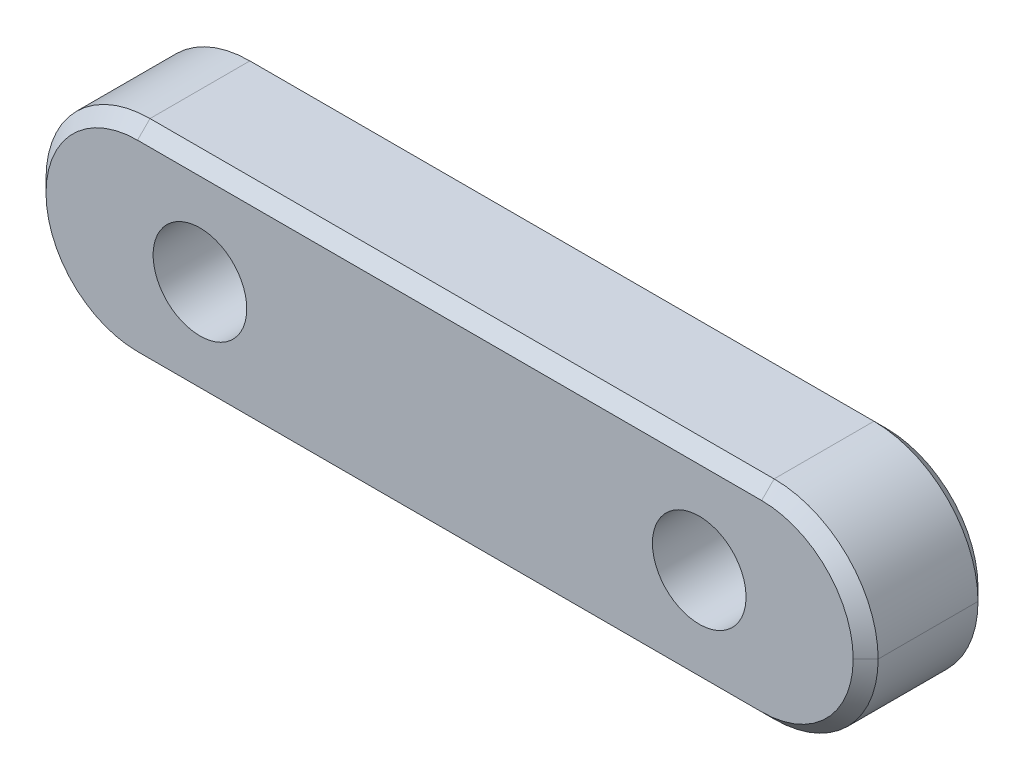
ISO-10303-21;
HEADER;
FILE_DESCRIPTION(('STEP AP214'),'2;1');
FILE_NAME('part.step','',(''),(''),'','','');
FILE_SCHEMA(('AUTOMOTIVE_DESIGN { 1 0 10303 214 1 1 1 1 }'));
ENDSEC;
DATA;
#1=APPLICATION_CONTEXT('core data for automotive mechanical design processes');
#2=APPLICATION_PROTOCOL_DEFINITION('international standard','automotive_design',2000,#1);
#3=PRODUCT_CONTEXT('',#1,'mechanical');
#4=PRODUCT('Part','Part','',(#3));
#5=PRODUCT_RELATED_PRODUCT_CATEGORY('part','',(#4));
#6=PRODUCT_DEFINITION_FORMATION('','',#4);
#7=PRODUCT_DEFINITION_CONTEXT('part definition',#1,'design');
#8=PRODUCT_DEFINITION('design','',#6,#7);
#9=PRODUCT_DEFINITION_SHAPE('','',#8);
#10=(LENGTH_UNIT() NAMED_UNIT(*) SI_UNIT(.MILLI.,.METRE.));
#11=(NAMED_UNIT(*) PLANE_ANGLE_UNIT() SI_UNIT($,.RADIAN.));
#12=(NAMED_UNIT(*) SI_UNIT($,.STERADIAN.) SOLID_ANGLE_UNIT());
#13=UNCERTAINTY_MEASURE_WITH_UNIT(LENGTH_MEASURE(1.E-05),#10,'distance_accuracy_value','');
#14=(GEOMETRIC_REPRESENTATION_CONTEXT(3) GLOBAL_UNCERTAINTY_ASSIGNED_CONTEXT((#13)) GLOBAL_UNIT_ASSIGNED_CONTEXT((#10,
#11,#12)) REPRESENTATION_CONTEXT('',''));
#15=CARTESIAN_POINT('',(0.,0.,0.));
#16=DIRECTION('',(0.,0.,1.));
#17=DIRECTION('',(1.,0.,0.));
#18=AXIS2_PLACEMENT_3D('',#15,#16,#17);
#19=CARTESIAN_POINT('',(-20.,5.,6.));
#20=DIRECTION('',(0.,-1.,0.));
#21=DIRECTION('',(0.,0.,-1.));
#22=AXIS2_PLACEMENT_3D('',#19,#20,#21);
#23=PLANE('',#22);
#24=DIRECTION('',(0.,0.,-1.));
#25=VECTOR('',#24,1.);
#26=CARTESIAN_POINT('',(15.,5.,6.));
#27=LINE('',#26,#25);
#28=CARTESIAN_POINT('',(15.,5.,5.4));
#29=VERTEX_POINT('',#28);
#30=CARTESIAN_POINT('',(15.,5.,0.600000000000003));
#31=VERTEX_POINT('',#30);
#32=EDGE_CURVE('E183',#29,#31,#27,.T.);
#33=ORIENTED_EDGE('',*,*,#32,.T.);
#34=DIRECTION('',(-1.,0.,0.));
#35=VECTOR('',#34,1.);
#36=CARTESIAN_POINT('',(-15.,5.,0.600000000000003));
#37=LINE('',#36,#35);
#38=CARTESIAN_POINT('',(-15.,5.,0.600000000000003));
#39=VERTEX_POINT('',#38);
#40=EDGE_CURVE('E241',#31,#39,#37,.T.);
#41=ORIENTED_EDGE('',*,*,#40,.T.);
#42=DIRECTION('',(0.,0.,-1.));
#43=VECTOR('',#42,1.);
#44=CARTESIAN_POINT('',(-15.,5.,6.));
#45=LINE('',#44,#43);
#46=CARTESIAN_POINT('',(-15.,5.,5.4));
#47=VERTEX_POINT('',#46);
#48=EDGE_CURVE('E178',#39,#47,#45,.F.);
#49=ORIENTED_EDGE('',*,*,#48,.T.);
#50=DIRECTION('',(1.,0.,0.));
#51=VECTOR('',#50,1.);
#52=CARTESIAN_POINT('',(-20.,5.,5.4));
#53=LINE('',#52,#51);
#54=EDGE_CURVE('E238',#47,#29,#53,.T.);
#55=ORIENTED_EDGE('',*,*,#54,.T.);
#56=EDGE_LOOP('',(#33,#41,#49,#55));
#57=FACE_BOUND('',#56,.T.);
#58=ADVANCED_FACE('F41',(#57),#23,.F.);
#59=CARTESIAN_POINT('',(-20.,-5.,6.));
#60=DIRECTION('',(0.,1.,0.));
#61=DIRECTION('',(0.,0.,1.));
#62=AXIS2_PLACEMENT_3D('',#59,#60,#61);
#63=PLANE('',#62);
#64=DIRECTION('',(0.,0.,-1.));
#65=VECTOR('',#64,1.);
#66=CARTESIAN_POINT('',(-15.,-5.,6.));
#67=LINE('',#66,#65);
#68=CARTESIAN_POINT('',(-15.,-5.,5.4));
#69=VERTEX_POINT('',#68);
#70=CARTESIAN_POINT('',(-15.,-5.,0.600000000000003));
#71=VERTEX_POINT('',#70);
#72=EDGE_CURVE('E169',#69,#71,#67,.T.);
#73=ORIENTED_EDGE('',*,*,#72,.T.);
#74=DIRECTION('',(1.,0.,0.));
#75=VECTOR('',#74,1.);
#76=CARTESIAN_POINT('',(15.,-5.,0.600000000000003));
#77=LINE('',#76,#75);
#78=CARTESIAN_POINT('',(15.,-5.,0.600000000000003));
#79=VERTEX_POINT('',#78);
#80=EDGE_CURVE('E141',#71,#79,#77,.T.);
#81=ORIENTED_EDGE('',*,*,#80,.T.);
#82=DIRECTION('',(0.,0.,-1.));
#83=VECTOR('',#82,1.);
#84=CARTESIAN_POINT('',(15.,-5.,6.));
#85=LINE('',#84,#83);
#86=CARTESIAN_POINT('',(15.,-5.,5.4));
#87=VERTEX_POINT('',#86);
#88=EDGE_CURVE('E167',#79,#87,#85,.F.);
#89=ORIENTED_EDGE('',*,*,#88,.T.);
#90=DIRECTION('',(-1.,0.,0.));
#91=VECTOR('',#90,1.);
#92=CARTESIAN_POINT('',(-20.,-5.,5.4));
#93=LINE('',#92,#91);
#94=EDGE_CURVE('E173',#87,#69,#93,.T.);
#95=ORIENTED_EDGE('',*,*,#94,.T.);
#96=EDGE_LOOP('',(#73,#81,#89,#95));
#97=FACE_BOUND('',#96,.T.);
#98=ADVANCED_FACE('F165',(#97),#63,.F.);
#99=CARTESIAN_POINT('',(0.,0.,6.));
#100=DIRECTION('',(0.,0.,-1.));
#101=DIRECTION('',(-1.,0.,0.));
#102=AXIS2_PLACEMENT_3D('',#99,#100,#101);
#103=PLANE('',#102);
#104=CARTESIAN_POINT('',(-15.,0.,6.));
#105=DIRECTION('',(0.,0.,-1.));
#106=DIRECTION('',(-1.,0.,0.));
#107=AXIS2_PLACEMENT_3D('',#104,#105,#106);
#108=CIRCLE('',#107,4.40000000000001);
#109=CARTESIAN_POINT('',(-19.4,0.,6.));
#110=VERTEX_POINT('',#109);
#111=CARTESIAN_POINT('',(-15.,-4.40000000000001,6.));
#112=VERTEX_POINT('',#111);
#113=EDGE_CURVE('E67',#110,#112,#108,.F.);
#114=ORIENTED_EDGE('',*,*,#113,.T.);
#115=DIRECTION('',(1.,0.,0.));
#116=VECTOR('',#115,1.);
#117=CARTESIAN_POINT('',(0.,-4.40000000000001,6.));
#118=LINE('',#117,#116);
#119=CARTESIAN_POINT('',(15.,-4.40000000000001,6.));
#120=VERTEX_POINT('',#119);
#121=EDGE_CURVE('E11',#112,#120,#118,.T.);
#122=ORIENTED_EDGE('',*,*,#121,.T.);
#123=CARTESIAN_POINT('',(15.,0.,6.));
#124=DIRECTION('',(0.,0.,-1.));
#125=DIRECTION('',(-1.,0.,0.));
#126=AXIS2_PLACEMENT_3D('',#123,#124,#125);
#127=CIRCLE('',#126,4.40000000000001);
#128=CARTESIAN_POINT('',(19.4,0.,6.));
#129=VERTEX_POINT('',#128);
#130=EDGE_CURVE('E52',#120,#129,#127,.F.);
#131=ORIENTED_EDGE('',*,*,#130,.T.);
#132=CARTESIAN_POINT('',(15.,0.,6.));
#133=DIRECTION('',(0.,0.,-1.));
#134=DIRECTION('',(-1.,0.,0.));
#135=AXIS2_PLACEMENT_3D('',#132,#133,#134);
#136=CIRCLE('',#135,4.40000000000001);
#137=CARTESIAN_POINT('',(15.,4.40000000000001,6.));
#138=VERTEX_POINT('',#137);
#139=EDGE_CURVE('E250',#129,#138,#136,.F.);
#140=ORIENTED_EDGE('',*,*,#139,.T.);
#141=DIRECTION('',(-1.,0.,0.));
#142=VECTOR('',#141,1.);
#143=CARTESIAN_POINT('',(0.,4.40000000000001,6.));
#144=LINE('',#143,#142);
#145=CARTESIAN_POINT('',(-15.,4.40000000000001,6.));
#146=VERTEX_POINT('',#145);
#147=EDGE_CURVE('E244',#138,#146,#144,.T.);
#148=ORIENTED_EDGE('',*,*,#147,.T.);
#149=CARTESIAN_POINT('',(-15.,0.,6.));
#150=DIRECTION('',(0.,0.,-1.));
#151=DIRECTION('',(-1.,0.,0.));
#152=AXIS2_PLACEMENT_3D('',#149,#150,#151);
#153=CIRCLE('',#152,4.40000000000001);
#154=EDGE_CURVE('E247',#146,#110,#153,.F.);
#155=ORIENTED_EDGE('',*,*,#154,.T.);
#156=EDGE_LOOP('',(#114,#122,#131,#140,#148,#155));
#157=FACE_BOUND('',#156,.T.);
#158=CARTESIAN_POINT('',(-12.,0.,6.));
#159=DIRECTION('',(0.,0.,1.));
#160=DIRECTION('',(1.,0.,0.));
#161=AXIS2_PLACEMENT_3D('',#158,#159,#160);
#162=CIRCLE('',#161,2.25);
#163=CARTESIAN_POINT('',(-9.75,0.,6.));
#164=VERTEX_POINT('',#163);
#165=EDGE_CURVE('E347',#164,#164,#162,.T.);
#166=ORIENTED_EDGE('',*,*,#165,.F.);
#167=EDGE_LOOP('',(#166));
#168=FACE_BOUND('',#167,.T.);
#169=CARTESIAN_POINT('',(12.,0.,6.));
#170=DIRECTION('',(0.,0.,1.));
#171=DIRECTION('',(-1.,0.,0.));
#172=AXIS2_PLACEMENT_3D('',#169,#170,#171);
#173=CIRCLE('',#172,2.25);
#174=CARTESIAN_POINT('',(9.75,0.,6.));
#175=VERTEX_POINT('',#174);
#176=EDGE_CURVE('E195',#175,#175,#173,.T.);
#177=ORIENTED_EDGE('',*,*,#176,.F.);
#178=EDGE_LOOP('',(#177));
#179=FACE_BOUND('',#178,.T.);
#180=ADVANCED_FACE('F337',(#157,#168,#179),#103,.F.);
#181=CARTESIAN_POINT('',(0.,0.,0.));
#182=DIRECTION('',(0.,0.,-1.));
#183=DIRECTION('',(-1.,0.,0.));
#184=AXIS2_PLACEMENT_3D('',#181,#182,#183);
#185=PLANE('',#184);
#186=CARTESIAN_POINT('',(15.,0.,0.));
#187=DIRECTION('',(0.,0.,-1.));
#188=DIRECTION('',(-1.,0.,0.));
#189=AXIS2_PLACEMENT_3D('',#186,#187,#188);
#190=CIRCLE('',#189,4.39999999999999);
#191=CARTESIAN_POINT('',(19.4,0.,0.));
#192=VERTEX_POINT('',#191);
#193=CARTESIAN_POINT('',(15.,-4.39999999999999,0.));
#194=VERTEX_POINT('',#193);
#195=EDGE_CURVE('E214',#192,#194,#190,.T.);
#196=ORIENTED_EDGE('',*,*,#195,.T.);
#197=DIRECTION('',(-1.,0.,0.));
#198=VECTOR('',#197,1.);
#199=CARTESIAN_POINT('',(-15.,-4.39999999999999,0.));
#200=LINE('',#199,#198);
#201=CARTESIAN_POINT('',(-15.,-4.39999999999999,0.));
#202=VERTEX_POINT('',#201);
#203=EDGE_CURVE('E143',#194,#202,#200,.T.);
#204=ORIENTED_EDGE('',*,*,#203,.T.);
#205=CARTESIAN_POINT('',(-15.,0.,0.));
#206=DIRECTION('',(0.,0.,-1.));
#207=DIRECTION('',(-1.,0.,0.));
#208=AXIS2_PLACEMENT_3D('',#205,#206,#207);
#209=CIRCLE('',#208,4.39999999999999);
#210=CARTESIAN_POINT('',(-19.4,0.,0.));
#211=VERTEX_POINT('',#210);
#212=EDGE_CURVE('E211',#202,#211,#209,.T.);
#213=ORIENTED_EDGE('',*,*,#212,.T.);
#214=CARTESIAN_POINT('',(-15.,0.,0.));
#215=DIRECTION('',(0.,0.,-1.));
#216=DIRECTION('',(-1.,0.,0.));
#217=AXIS2_PLACEMENT_3D('',#214,#215,#216);
#218=CIRCLE('',#217,4.39999999999999);
#219=CARTESIAN_POINT('',(-15.,4.39999999999999,0.));
#220=VERTEX_POINT('',#219);
#221=EDGE_CURVE('E205',#211,#220,#218,.T.);
#222=ORIENTED_EDGE('',*,*,#221,.T.);
#223=DIRECTION('',(1.,0.,0.));
#224=VECTOR('',#223,1.);
#225=CARTESIAN_POINT('',(15.,4.39999999999999,0.));
#226=LINE('',#225,#224);
#227=CARTESIAN_POINT('',(15.,4.39999999999999,0.));
#228=VERTEX_POINT('',#227);
#229=EDGE_CURVE('E172',#220,#228,#226,.T.);
#230=ORIENTED_EDGE('',*,*,#229,.T.);
#231=CARTESIAN_POINT('',(15.,0.,0.));
#232=DIRECTION('',(0.,0.,-1.));
#233=DIRECTION('',(-1.,0.,0.));
#234=AXIS2_PLACEMENT_3D('',#231,#232,#233);
#235=CIRCLE('',#234,4.39999999999999);
#236=EDGE_CURVE('E208',#228,#192,#235,.T.);
#237=ORIENTED_EDGE('',*,*,#236,.T.);
#238=EDGE_LOOP('',(#196,#204,#213,#222,#230,#237));
#239=FACE_BOUND('',#238,.T.);
#240=CARTESIAN_POINT('',(-12.,0.,0.));
#241=DIRECTION('',(0.,0.,1.));
#242=DIRECTION('',(1.,0.,0.));
#243=AXIS2_PLACEMENT_3D('',#240,#241,#242);
#244=CIRCLE('',#243,2.25);
#245=CARTESIAN_POINT('',(-9.75,0.,0.));
#246=VERTEX_POINT('',#245);
#247=EDGE_CURVE('E185',#246,#246,#244,.T.);
#248=ORIENTED_EDGE('',*,*,#247,.T.);
#249=EDGE_LOOP('',(#248));
#250=FACE_BOUND('',#249,.T.);
#251=CARTESIAN_POINT('',(12.,0.,0.));
#252=DIRECTION('',(0.,0.,1.));
#253=DIRECTION('',(-1.,0.,0.));
#254=AXIS2_PLACEMENT_3D('',#251,#252,#253);
#255=CIRCLE('',#254,2.25);
#256=CARTESIAN_POINT('',(9.75,0.,0.));
#257=VERTEX_POINT('',#256);
#258=EDGE_CURVE('E344',#257,#257,#255,.T.);
#259=ORIENTED_EDGE('',*,*,#258,.T.);
#260=EDGE_LOOP('',(#259));
#261=FACE_BOUND('',#260,.T.);
#262=ADVANCED_FACE('F333',(#239,#250,#261),#185,.T.);
#263=CARTESIAN_POINT('',(12.,0.,0.));
#264=DIRECTION('',(0.,0.,1.));
#265=DIRECTION('',(1.,0.,0.));
#266=AXIS2_PLACEMENT_3D('',#263,#264,#265);
#267=CYLINDRICAL_SURFACE('',#266,2.25);
#268=ORIENTED_EDGE('',*,*,#258,.F.);
#269=EDGE_LOOP('',(#268));
#270=FACE_BOUND('',#269,.T.);
#271=ORIENTED_EDGE('',*,*,#176,.T.);
#272=EDGE_LOOP('',(#271));
#273=FACE_BOUND('',#272,.T.);
#274=ADVANCED_FACE('F336',(#270,#273),#267,.F.);
#275=CARTESIAN_POINT('',(-12.,0.,0.));
#276=DIRECTION('',(0.,0.,1.));
#277=DIRECTION('',(1.,0.,0.));
#278=AXIS2_PLACEMENT_3D('',#275,#276,#277);
#279=CYLINDRICAL_SURFACE('',#278,2.25);
#280=ORIENTED_EDGE('',*,*,#247,.F.);
#281=EDGE_LOOP('',(#280));
#282=FACE_BOUND('',#281,.T.);
#283=ORIENTED_EDGE('',*,*,#165,.T.);
#284=EDGE_LOOP('',(#283));
#285=FACE_BOUND('',#284,.T.);
#286=ADVANCED_FACE('F376',(#282,#285),#279,.F.);
#287=CARTESIAN_POINT('',(15.,0.,6.));
#288=DIRECTION('',(0.,0.,-1.));
#289=DIRECTION('',(-1.,0.,0.));
#290=AXIS2_PLACEMENT_3D('',#287,#288,#289);
#291=CYLINDRICAL_SURFACE('',#290,5.);
#292=DIRECTION('',(0.,0.,-1.));
#293=VECTOR('',#292,1.);
#294=CARTESIAN_POINT('',(20.,0.,6.));
#295=LINE('',#294,#293);
#296=CARTESIAN_POINT('',(20.,0.,0.600000000000003));
#297=VERTEX_POINT('',#296);
#298=CARTESIAN_POINT('',(20.,0.,5.4));
#299=VERTEX_POINT('',#298);
#300=EDGE_CURVE('E192',#297,#299,#295,.F.);
#301=ORIENTED_EDGE('',*,*,#300,.F.);
#302=CARTESIAN_POINT('',(15.,0.,0.600000000000003));
#303=DIRECTION('',(0.,0.,-1.));
#304=DIRECTION('',(-1.,0.,0.));
#305=AXIS2_PLACEMENT_3D('',#302,#303,#304);
#306=CIRCLE('',#305,5.);
#307=EDGE_CURVE('E229',#297,#31,#306,.F.);
#308=ORIENTED_EDGE('',*,*,#307,.T.);
#309=ORIENTED_EDGE('',*,*,#32,.F.);
#310=CARTESIAN_POINT('',(15.,0.,5.4));
#311=DIRECTION('',(0.,0.,-1.));
#312=DIRECTION('',(-1.,0.,0.));
#313=AXIS2_PLACEMENT_3D('',#310,#311,#312);
#314=CIRCLE('',#313,5.);
#315=EDGE_CURVE('E226',#29,#299,#314,.T.);
#316=ORIENTED_EDGE('',*,*,#315,.T.);
#317=EDGE_LOOP('',(#301,#308,#309,#316));
#318=FACE_BOUND('',#317,.T.);
#319=ADVANCED_FACE('F307',(#318),#291,.T.);
#320=CARTESIAN_POINT('',(15.,0.,6.));
#321=DIRECTION('',(0.,0.,-1.));
#322=DIRECTION('',(-1.,0.,0.));
#323=AXIS2_PLACEMENT_3D('',#320,#321,#322);
#324=CYLINDRICAL_SURFACE('',#323,5.);
#325=ORIENTED_EDGE('',*,*,#88,.F.);
#326=CARTESIAN_POINT('',(15.,0.,0.600000000000003));
#327=DIRECTION('',(0.,0.,-1.));
#328=DIRECTION('',(-1.,0.,0.));
#329=AXIS2_PLACEMENT_3D('',#326,#327,#328);
#330=CIRCLE('',#329,5.);
#331=EDGE_CURVE('E150',#79,#297,#330,.F.);
#332=ORIENTED_EDGE('',*,*,#331,.T.);
#333=ORIENTED_EDGE('',*,*,#300,.T.);
#334=CARTESIAN_POINT('',(15.,0.,5.4));
#335=DIRECTION('',(0.,0.,-1.));
#336=DIRECTION('',(-1.,0.,0.));
#337=AXIS2_PLACEMENT_3D('',#334,#335,#336);
#338=CIRCLE('',#337,5.);
#339=EDGE_CURVE('E160',#299,#87,#338,.T.);
#340=ORIENTED_EDGE('',*,*,#339,.T.);
#341=EDGE_LOOP('',(#325,#332,#333,#340));
#342=FACE_BOUND('',#341,.T.);
#343=ADVANCED_FACE('F175',(#342),#324,.T.);
#344=CARTESIAN_POINT('',(-15.,0.,6.));
#345=DIRECTION('',(0.,0.,-1.));
#346=DIRECTION('',(-1.,0.,0.));
#347=AXIS2_PLACEMENT_3D('',#344,#345,#346);
#348=CYLINDRICAL_SURFACE('',#347,5.);
#349=ORIENTED_EDGE('',*,*,#48,.F.);
#350=CARTESIAN_POINT('',(-15.,0.,0.600000000000003));
#351=DIRECTION('',(0.,0.,-1.));
#352=DIRECTION('',(-1.,0.,0.));
#353=AXIS2_PLACEMENT_3D('',#350,#351,#352);
#354=CIRCLE('',#353,5.);
#355=CARTESIAN_POINT('',(-20.,0.,0.600000000000003));
#356=VERTEX_POINT('',#355);
#357=EDGE_CURVE('E235',#39,#356,#354,.F.);
#358=ORIENTED_EDGE('',*,*,#357,.T.);
#359=DIRECTION('',(0.,0.,-1.));
#360=VECTOR('',#359,1.);
#361=CARTESIAN_POINT('',(-20.,0.,6.));
#362=LINE('',#361,#360);
#363=CARTESIAN_POINT('',(-20.,0.,5.4));
#364=VERTEX_POINT('',#363);
#365=EDGE_CURVE('E196',#364,#356,#362,.T.);
#366=ORIENTED_EDGE('',*,*,#365,.F.);
#367=CARTESIAN_POINT('',(-15.,0.,5.4));
#368=DIRECTION('',(0.,0.,-1.));
#369=DIRECTION('',(-1.,0.,0.));
#370=AXIS2_PLACEMENT_3D('',#367,#368,#369);
#371=CIRCLE('',#370,5.);
#372=EDGE_CURVE('E232',#364,#47,#371,.T.);
#373=ORIENTED_EDGE('',*,*,#372,.T.);
#374=EDGE_LOOP('',(#349,#358,#366,#373));
#375=FACE_BOUND('',#374,.T.);
#376=ADVANCED_FACE('F319',(#375),#348,.T.);
#377=CARTESIAN_POINT('',(-15.,0.,6.));
#378=DIRECTION('',(0.,0.,-1.));
#379=DIRECTION('',(-1.,0.,0.));
#380=AXIS2_PLACEMENT_3D('',#377,#378,#379);
#381=CYLINDRICAL_SURFACE('',#380,5.);
#382=ORIENTED_EDGE('',*,*,#365,.T.);
#383=CARTESIAN_POINT('',(-15.,0.,0.600000000000003));
#384=DIRECTION('',(0.,0.,-1.));
#385=DIRECTION('',(-1.,0.,0.));
#386=AXIS2_PLACEMENT_3D('',#383,#384,#385);
#387=CIRCLE('',#386,5.);
#388=EDGE_CURVE('E223',#356,#71,#387,.F.);
#389=ORIENTED_EDGE('',*,*,#388,.T.);
#390=ORIENTED_EDGE('',*,*,#72,.F.);
#391=CARTESIAN_POINT('',(-15.,0.,5.4));
#392=DIRECTION('',(0.,0.,-1.));
#393=DIRECTION('',(-1.,0.,0.));
#394=AXIS2_PLACEMENT_3D('',#391,#392,#393);
#395=CIRCLE('',#394,5.);
#396=EDGE_CURVE('E159',#69,#364,#395,.T.);
#397=ORIENTED_EDGE('',*,*,#396,.T.);
#398=EDGE_LOOP('',(#382,#389,#390,#397));
#399=FACE_BOUND('',#398,.T.);
#400=ADVANCED_FACE('F323',(#399),#381,.T.);
#401=CARTESIAN_POINT('',(-20.,5.,0.600000000000003));
#402=DIRECTION('',(0.,0.707106781186545,-0.70710678118655));
#403=DIRECTION('',(1.,0.,0.));
#404=AXIS2_PLACEMENT_3D('',#401,#402,#403);
#405=PLANE('',#404);
#406=DIRECTION('',(0.,0.70710678118655,0.707106781186545));
#407=VECTOR('',#406,1.);
#408=CARTESIAN_POINT('',(15.,4.39999999999999,0.));
#409=LINE('',#408,#407);
#410=EDGE_CURVE('E265',#228,#31,#409,.T.);
#411=ORIENTED_EDGE('',*,*,#410,.F.);
#412=ORIENTED_EDGE('',*,*,#229,.F.);
#413=DIRECTION('',(0.,-0.70710678118655,-0.707106781186545));
#414=VECTOR('',#413,1.);
#415=CARTESIAN_POINT('',(-15.,5.,0.600000000000003));
#416=LINE('',#415,#414);
#417=EDGE_CURVE('E200',#39,#220,#416,.T.);
#418=ORIENTED_EDGE('',*,*,#417,.F.);
#419=ORIENTED_EDGE('',*,*,#40,.F.);
#420=EDGE_LOOP('',(#411,#412,#418,#419));
#421=FACE_BOUND('',#420,.T.);
#422=ADVANCED_FACE('F315',(#421),#405,.T.);
#423=CARTESIAN_POINT('',(-15.,0.,0.));
#424=DIRECTION('',(0.,0.,1.));
#425=DIRECTION('',(1.,0.,0.));
#426=AXIS2_PLACEMENT_3D('',#423,#424,#425);
#427=CONICAL_SURFACE('',#426,4.39999999999999,0.78539816339745);
#428=ORIENTED_EDGE('',*,*,#417,.T.);
#429=ORIENTED_EDGE('',*,*,#221,.F.);
#430=DIRECTION('',(0.70710678118655,0.,-0.707106781186545));
#431=VECTOR('',#430,1.);
#432=CARTESIAN_POINT('',(-20.,0.,0.600000000000003));
#433=LINE('',#432,#431);
#434=EDGE_CURVE('E261',#356,#211,#433,.T.);
#435=ORIENTED_EDGE('',*,*,#434,.F.);
#436=ORIENTED_EDGE('',*,*,#357,.F.);
#437=EDGE_LOOP('',(#428,#429,#435,#436));
#438=FACE_BOUND('',#437,.T.);
#439=ADVANCED_FACE('F328',(#438),#427,.T.);
#440=CARTESIAN_POINT('',(15.,0.,0.));
#441=DIRECTION('',(0.,0.,1.));
#442=DIRECTION('',(1.,0.,0.));
#443=AXIS2_PLACEMENT_3D('',#440,#441,#442);
#444=CONICAL_SURFACE('',#443,4.39999999999999,0.785398163397451);
#445=ORIENTED_EDGE('',*,*,#410,.T.);
#446=ORIENTED_EDGE('',*,*,#307,.F.);
#447=DIRECTION('',(0.70710678118655,0.,0.707106781186545));
#448=VECTOR('',#447,1.);
#449=CARTESIAN_POINT('',(19.4,0.,0.));
#450=LINE('',#449,#448);
#451=EDGE_CURVE('E153',#192,#297,#450,.T.);
#452=ORIENTED_EDGE('',*,*,#451,.F.);
#453=ORIENTED_EDGE('',*,*,#236,.F.);
#454=EDGE_LOOP('',(#445,#446,#452,#453));
#455=FACE_BOUND('',#454,.T.);
#456=ADVANCED_FACE('F310',(#455),#444,.T.);
#457=CARTESIAN_POINT('',(-15.,0.,0.));
#458=DIRECTION('',(0.,0.,1.));
#459=DIRECTION('',(1.,0.,0.));
#460=AXIS2_PLACEMENT_3D('',#457,#458,#459);
#461=CONICAL_SURFACE('',#460,4.39999999999999,0.785398163397451);
#462=ORIENTED_EDGE('',*,*,#434,.T.);
#463=ORIENTED_EDGE('',*,*,#212,.F.);
#464=DIRECTION('',(0.,0.707106781186549,-0.707106781186546));
#465=VECTOR('',#464,1.);
#466=CARTESIAN_POINT('',(-15.,-5.,0.600000000000003));
#467=LINE('',#466,#465);
#468=EDGE_CURVE('E147',#71,#202,#467,.T.);
#469=ORIENTED_EDGE('',*,*,#468,.F.);
#470=ORIENTED_EDGE('',*,*,#388,.F.);
#471=EDGE_LOOP('',(#462,#463,#469,#470));
#472=FACE_BOUND('',#471,.T.);
#473=ADVANCED_FACE('F331',(#472),#461,.T.);
#474=CARTESIAN_POINT('',(15.,0.,0.));
#475=DIRECTION('',(0.,0.,1.));
#476=DIRECTION('',(1.,0.,0.));
#477=AXIS2_PLACEMENT_3D('',#474,#475,#476);
#478=CONICAL_SURFACE('',#477,4.39999999999999,0.78539816339745);
#479=ORIENTED_EDGE('',*,*,#451,.T.);
#480=ORIENTED_EDGE('',*,*,#331,.F.);
#481=DIRECTION('',(0.,-0.707106781186549,0.707106781186546));
#482=VECTOR('',#481,1.);
#483=CARTESIAN_POINT('',(15.,-4.39999999999999,0.));
#484=LINE('',#483,#482);
#485=EDGE_CURVE('E137',#194,#79,#484,.T.);
#486=ORIENTED_EDGE('',*,*,#485,.F.);
#487=ORIENTED_EDGE('',*,*,#195,.F.);
#488=EDGE_LOOP('',(#479,#480,#486,#487));
#489=FACE_BOUND('',#488,.T.);
#490=ADVANCED_FACE('F151',(#489),#478,.T.);
#491=CARTESIAN_POINT('',(-20.,-5.,0.600000000000003));
#492=DIRECTION('',(0.,-0.707106781186545,-0.70710678118655));
#493=DIRECTION('',(-1.,0.,0.));
#494=AXIS2_PLACEMENT_3D('',#491,#492,#493);
#495=PLANE('',#494);
#496=ORIENTED_EDGE('',*,*,#468,.T.);
#497=ORIENTED_EDGE('',*,*,#203,.F.);
#498=ORIENTED_EDGE('',*,*,#485,.T.);
#499=ORIENTED_EDGE('',*,*,#80,.F.);
#500=EDGE_LOOP('',(#496,#497,#498,#499));
#501=FACE_BOUND('',#500,.T.);
#502=ADVANCED_FACE('F139',(#501),#495,.T.);
#503=CARTESIAN_POINT('',(0.,4.40000000000001,6.));
#504=DIRECTION('',(0.,-0.70710678118655,-0.707106781186545));
#505=DIRECTION('',(-1.,0.,0.));
#506=AXIS2_PLACEMENT_3D('',#503,#504,#505);
#507=PLANE('',#506);
#508=DIRECTION('',(0.,-0.707106781186545,0.70710678118655));
#509=VECTOR('',#508,1.);
#510=CARTESIAN_POINT('',(15.,5.,5.4));
#511=LINE('',#510,#509);
#512=EDGE_CURVE('E284',#29,#138,#511,.T.);
#513=ORIENTED_EDGE('',*,*,#512,.F.);
#514=ORIENTED_EDGE('',*,*,#54,.F.);
#515=DIRECTION('',(0.,0.707106781186545,-0.70710678118655));
#516=VECTOR('',#515,1.);
#517=CARTESIAN_POINT('',(-15.,4.40000000000001,6.));
#518=LINE('',#517,#516);
#519=EDGE_CURVE('E46',#146,#47,#518,.T.);
#520=ORIENTED_EDGE('',*,*,#519,.F.);
#521=ORIENTED_EDGE('',*,*,#147,.F.);
#522=EDGE_LOOP('',(#513,#514,#520,#521));
#523=FACE_BOUND('',#522,.T.);
#524=ADVANCED_FACE('F44',(#523),#507,.F.);
#525=CARTESIAN_POINT('',(-15.,0.,6.));
#526=DIRECTION('',(0.,0.,-1.));
#527=DIRECTION('',(-1.,0.,0.));
#528=AXIS2_PLACEMENT_3D('',#525,#526,#527);
#529=CONICAL_SURFACE('',#528,4.40000000000001,0.785398163397445);
#530=ORIENTED_EDGE('',*,*,#519,.T.);
#531=ORIENTED_EDGE('',*,*,#372,.F.);
#532=DIRECTION('',(-0.707106781186545,0.,-0.70710678118655));
#533=VECTOR('',#532,1.);
#534=CARTESIAN_POINT('',(-19.4,0.,6.));
#535=LINE('',#534,#533);
#536=EDGE_CURVE('E281',#110,#364,#535,.T.);
#537=ORIENTED_EDGE('',*,*,#536,.F.);
#538=ORIENTED_EDGE('',*,*,#154,.F.);
#539=EDGE_LOOP('',(#530,#531,#537,#538));
#540=FACE_BOUND('',#539,.T.);
#541=ADVANCED_FACE('F297',(#540),#529,.T.);
#542=CARTESIAN_POINT('',(15.,0.,6.));
#543=DIRECTION('',(0.,0.,-1.));
#544=DIRECTION('',(-1.,0.,0.));
#545=AXIS2_PLACEMENT_3D('',#542,#543,#544);
#546=CONICAL_SURFACE('',#545,4.40000000000001,0.785398163397446);
#547=ORIENTED_EDGE('',*,*,#512,.T.);
#548=ORIENTED_EDGE('',*,*,#139,.F.);
#549=DIRECTION('',(-0.707106781186545,0.,0.70710678118655));
#550=VECTOR('',#549,1.);
#551=CARTESIAN_POINT('',(20.,0.,5.4));
#552=LINE('',#551,#550);
#553=EDGE_CURVE('E277',#299,#129,#552,.T.);
#554=ORIENTED_EDGE('',*,*,#553,.F.);
#555=ORIENTED_EDGE('',*,*,#315,.F.);
#556=EDGE_LOOP('',(#547,#548,#554,#555));
#557=FACE_BOUND('',#556,.T.);
#558=ADVANCED_FACE('F431',(#557),#546,.T.);
#559=CARTESIAN_POINT('',(-15.,0.,6.));
#560=DIRECTION('',(0.,0.,-1.));
#561=DIRECTION('',(-1.,0.,0.));
#562=AXIS2_PLACEMENT_3D('',#559,#560,#561);
#563=CONICAL_SURFACE('',#562,4.40000000000001,0.785398163397446);
#564=ORIENTED_EDGE('',*,*,#536,.T.);
#565=ORIENTED_EDGE('',*,*,#396,.F.);
#566=DIRECTION('',(0.,-0.707106781186545,-0.70710678118655));
#567=VECTOR('',#566,1.);
#568=CARTESIAN_POINT('',(-15.,-4.40000000000001,6.));
#569=LINE('',#568,#567);
#570=EDGE_CURVE('E274',#112,#69,#569,.T.);
#571=ORIENTED_EDGE('',*,*,#570,.F.);
#572=ORIENTED_EDGE('',*,*,#113,.F.);
#573=EDGE_LOOP('',(#564,#565,#571,#572));
#574=FACE_BOUND('',#573,.T.);
#575=ADVANCED_FACE('F424',(#574),#563,.T.);
#576=CARTESIAN_POINT('',(15.,0.,6.));
#577=DIRECTION('',(0.,0.,-1.));
#578=DIRECTION('',(-1.,0.,0.));
#579=AXIS2_PLACEMENT_3D('',#576,#577,#578);
#580=CONICAL_SURFACE('',#579,4.40000000000001,0.785398163397445);
#581=ORIENTED_EDGE('',*,*,#553,.T.);
#582=ORIENTED_EDGE('',*,*,#130,.F.);
#583=DIRECTION('',(0.,0.707106781186545,0.70710678118655));
#584=VECTOR('',#583,1.);
#585=CARTESIAN_POINT('',(15.,-5.,5.4));
#586=LINE('',#585,#584);
#587=EDGE_CURVE('E60',#87,#120,#586,.T.);
#588=ORIENTED_EDGE('',*,*,#587,.F.);
#589=ORIENTED_EDGE('',*,*,#339,.F.);
#590=EDGE_LOOP('',(#581,#582,#588,#589));
#591=FACE_BOUND('',#590,.T.);
#592=ADVANCED_FACE('F418',(#591),#580,.T.);
#593=CARTESIAN_POINT('',(0.,-4.40000000000001,6.));
#594=DIRECTION('',(0.,0.70710678118655,-0.707106781186545));
#595=DIRECTION('',(1.,0.,0.));
#596=AXIS2_PLACEMENT_3D('',#593,#594,#595);
#597=PLANE('',#596);
#598=ORIENTED_EDGE('',*,*,#570,.T.);
#599=ORIENTED_EDGE('',*,*,#94,.F.);
#600=ORIENTED_EDGE('',*,*,#587,.T.);
#601=ORIENTED_EDGE('',*,*,#121,.F.);
#602=EDGE_LOOP('',(#598,#599,#600,#601));
#603=FACE_BOUND('',#602,.T.);
#604=ADVANCED_FACE('F412',(#603),#597,.F.);
#605=CLOSED_SHELL('',(#58,#98,#180,#262,#274,#286,#319,#343,#376,#400,#422,#439,#456,#473,#490,
#502,#524,#541,#558,#575,#592,#604));
#606=MANIFOLD_SOLID_BREP('B2',#605);
#607=ADVANCED_BREP_SHAPE_REPRESENTATION('',(#18,#606),#14);
#608=SHAPE_DEFINITION_REPRESENTATION(#9,#607);
ENDSEC;
END-ISO-10303-21;
